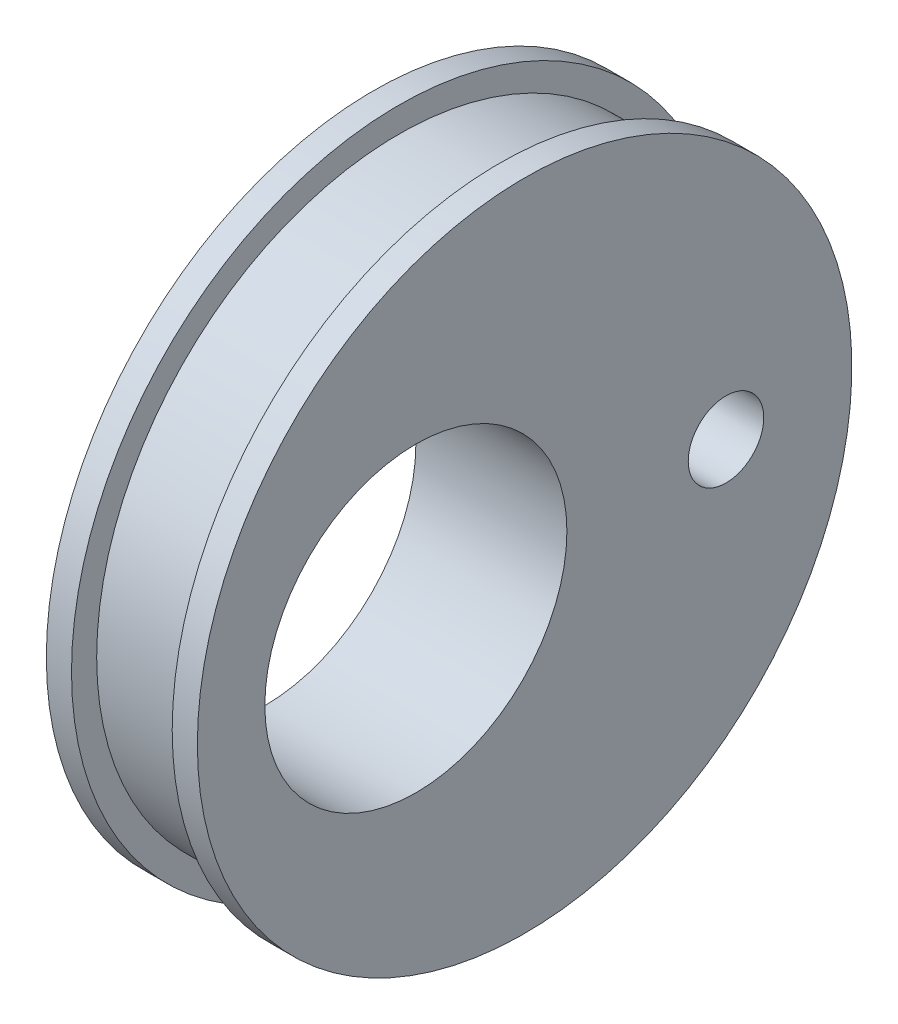
ISO-10303-21;
HEADER;
FILE_DESCRIPTION(('STEP AP214'),'2;1');
FILE_NAME('part.step','',(''),(''),'','','');
FILE_SCHEMA(('AUTOMOTIVE_DESIGN { 1 0 10303 214 1 1 1 1 }'));
ENDSEC;
DATA;
#1=APPLICATION_CONTEXT('core data for automotive mechanical design processes');
#2=APPLICATION_PROTOCOL_DEFINITION('international standard','automotive_design',2000,#1);
#3=PRODUCT_CONTEXT('',#1,'mechanical');
#4=PRODUCT('Part','Part','',(#3));
#5=PRODUCT_RELATED_PRODUCT_CATEGORY('part','',(#4));
#6=PRODUCT_DEFINITION_FORMATION('','',#4);
#7=PRODUCT_DEFINITION_CONTEXT('part definition',#1,'design');
#8=PRODUCT_DEFINITION('design','',#6,#7);
#9=PRODUCT_DEFINITION_SHAPE('','',#8);
#10=(LENGTH_UNIT() NAMED_UNIT(*) SI_UNIT(.MILLI.,.METRE.));
#11=(NAMED_UNIT(*) PLANE_ANGLE_UNIT() SI_UNIT($,.RADIAN.));
#12=(NAMED_UNIT(*) SI_UNIT($,.STERADIAN.) SOLID_ANGLE_UNIT());
#13=UNCERTAINTY_MEASURE_WITH_UNIT(LENGTH_MEASURE(1.E-05),#10,'distance_accuracy_value','');
#14=(GEOMETRIC_REPRESENTATION_CONTEXT(3) GLOBAL_UNCERTAINTY_ASSIGNED_CONTEXT((#13)) GLOBAL_UNIT_ASSIGNED_CONTEXT((#10,
#11,#12)) REPRESENTATION_CONTEXT('',''));
#15=CARTESIAN_POINT('',(0.,0.,0.));
#16=DIRECTION('',(0.,0.,1.));
#17=DIRECTION('',(1.,0.,0.));
#18=AXIS2_PLACEMENT_3D('',#15,#16,#17);
#19=CARTESIAN_POINT('',(9.525,19.05,0.));
#20=DIRECTION('',(-1.,0.,0.));
#21=DIRECTION('',(0.,0.,1.));
#22=AXIS2_PLACEMENT_3D('',#19,#20,#21);
#23=PLANE('',#22);
#24=CARTESIAN_POINT('',(9.525,0.,-12.7));
#25=DIRECTION('',(-1.,0.,0.));
#26=DIRECTION('',(0.,0.,1.));
#27=AXIS2_PLACEMENT_3D('',#24,#25,#26);
#28=CIRCLE('',#27,2.38125);
#29=CARTESIAN_POINT('',(9.525,0.,-10.31875));
#30=VERTEX_POINT('',#29);
#31=EDGE_CURVE('E68',#30,#30,#28,.T.);
#32=ORIENTED_EDGE('',*,*,#31,.T.);
#33=EDGE_LOOP('',(#32));
#34=FACE_BOUND('',#33,.T.);
#35=CARTESIAN_POINT('',(9.525,0.,6.858));
#36=DIRECTION('',(-1.,0.,0.));
#37=DIRECTION('',(0.,0.,1.));
#38=AXIS2_PLACEMENT_3D('',#35,#36,#37);
#39=CIRCLE('',#38,9.525);
#40=CARTESIAN_POINT('',(9.525,0.,16.383));
#41=VERTEX_POINT('',#40);
#42=EDGE_CURVE('E73',#41,#41,#39,.T.);
#43=ORIENTED_EDGE('',*,*,#42,.T.);
#44=EDGE_LOOP('',(#43));
#45=FACE_BOUND('',#44,.T.);
#46=CARTESIAN_POINT('',(9.525,0.,0.));
#47=DIRECTION('',(-1.,0.,0.));
#48=DIRECTION('',(0.,0.,1.));
#49=AXIS2_PLACEMENT_3D('',#46,#47,#48);
#50=CIRCLE('',#49,20.6375);
#51=CARTESIAN_POINT('',(9.525,0.,20.6375));
#52=VERTEX_POINT('',#51);
#53=EDGE_CURVE('E10',#52,#52,#50,.T.);
#54=ORIENTED_EDGE('',*,*,#53,.F.);
#55=EDGE_LOOP('',(#54));
#56=FACE_BOUND('',#55,.T.);
#57=ADVANCED_FACE('F37',(#34,#45,#56),#23,.F.);
#58=CARTESIAN_POINT('',(0.,0.,0.));
#59=DIRECTION('',(-1.,0.,0.));
#60=DIRECTION('',(0.,0.,1.));
#61=AXIS2_PLACEMENT_3D('',#58,#59,#60);
#62=CYLINDRICAL_SURFACE('',#61,20.6375);
#63=CARTESIAN_POINT('',(7.9375,0.,0.));
#64=DIRECTION('',(-1.,0.,0.));
#65=DIRECTION('',(0.,0.,1.));
#66=AXIS2_PLACEMENT_3D('',#63,#64,#65);
#67=CIRCLE('',#66,20.6375);
#68=CARTESIAN_POINT('',(7.9375,0.,20.6375));
#69=VERTEX_POINT('',#68);
#70=EDGE_CURVE('E44',#69,#69,#67,.T.);
#71=ORIENTED_EDGE('',*,*,#70,.F.);
#72=EDGE_LOOP('',(#71));
#73=FACE_BOUND('',#72,.T.);
#74=ORIENTED_EDGE('',*,*,#53,.T.);
#75=EDGE_LOOP('',(#74));
#76=FACE_BOUND('',#75,.T.);
#77=ADVANCED_FACE('F122',(#73,#76),#62,.T.);
#78=CARTESIAN_POINT('',(7.9375,20.6375,0.));
#79=DIRECTION('',(1.,0.,0.));
#80=DIRECTION('',(0.,0.,-1.));
#81=AXIS2_PLACEMENT_3D('',#78,#79,#80);
#82=PLANE('',#81);
#83=CARTESIAN_POINT('',(7.9375,0.,0.));
#84=DIRECTION('',(-1.,0.,0.));
#85=DIRECTION('',(0.,0.,1.));
#86=AXIS2_PLACEMENT_3D('',#83,#84,#85);
#87=CIRCLE('',#86,19.05);
#88=CARTESIAN_POINT('',(7.9375,0.,19.05));
#89=VERTEX_POINT('',#88);
#90=EDGE_CURVE('E49',#89,#89,#87,.T.);
#91=ORIENTED_EDGE('',*,*,#90,.F.);
#92=EDGE_LOOP('',(#91));
#93=FACE_BOUND('',#92,.T.);
#94=ORIENTED_EDGE('',*,*,#70,.T.);
#95=EDGE_LOOP('',(#94));
#96=FACE_BOUND('',#95,.T.);
#97=ADVANCED_FACE('F117',(#93,#96),#82,.F.);
#98=CARTESIAN_POINT('',(0.,0.,0.));
#99=DIRECTION('',(-1.,0.,0.));
#100=DIRECTION('',(0.,0.,1.));
#101=AXIS2_PLACEMENT_3D('',#98,#99,#100);
#102=CYLINDRICAL_SURFACE('',#101,19.05);
#103=CARTESIAN_POINT('',(1.5875,0.,0.));
#104=DIRECTION('',(-1.,0.,0.));
#105=DIRECTION('',(0.,0.,1.));
#106=AXIS2_PLACEMENT_3D('',#103,#104,#105);
#107=CIRCLE('',#106,19.05);
#108=CARTESIAN_POINT('',(1.5875,0.,19.05));
#109=VERTEX_POINT('',#108);
#110=EDGE_CURVE('E54',#109,#109,#107,.T.);
#111=ORIENTED_EDGE('',*,*,#110,.F.);
#112=EDGE_LOOP('',(#111));
#113=FACE_BOUND('',#112,.T.);
#114=ORIENTED_EDGE('',*,*,#90,.T.);
#115=EDGE_LOOP('',(#114));
#116=FACE_BOUND('',#115,.T.);
#117=ADVANCED_FACE('F111',(#113,#116),#102,.T.);
#118=CARTESIAN_POINT('',(1.5875,20.6375,0.));
#119=DIRECTION('',(-1.,0.,0.));
#120=DIRECTION('',(0.,0.,1.));
#121=AXIS2_PLACEMENT_3D('',#118,#119,#120);
#122=PLANE('',#121);
#123=CARTESIAN_POINT('',(1.5875,0.,0.));
#124=DIRECTION('',(-1.,0.,0.));
#125=DIRECTION('',(0.,0.,1.));
#126=AXIS2_PLACEMENT_3D('',#123,#124,#125);
#127=CIRCLE('',#126,20.6375);
#128=CARTESIAN_POINT('',(1.5875,0.,20.6375));
#129=VERTEX_POINT('',#128);
#130=EDGE_CURVE('E60',#129,#129,#127,.T.);
#131=ORIENTED_EDGE('',*,*,#130,.F.);
#132=EDGE_LOOP('',(#131));
#133=FACE_BOUND('',#132,.T.);
#134=ORIENTED_EDGE('',*,*,#110,.T.);
#135=EDGE_LOOP('',(#134));
#136=FACE_BOUND('',#135,.T.);
#137=ADVANCED_FACE('F105',(#133,#136),#122,.F.);
#138=CARTESIAN_POINT('',(0.,0.,0.));
#139=DIRECTION('',(-1.,0.,0.));
#140=DIRECTION('',(0.,0.,1.));
#141=AXIS2_PLACEMENT_3D('',#138,#139,#140);
#142=CYLINDRICAL_SURFACE('',#141,20.6375);
#143=CARTESIAN_POINT('',(0.,0.,0.));
#144=DIRECTION('',(-1.,0.,0.));
#145=DIRECTION('',(0.,0.,1.));
#146=AXIS2_PLACEMENT_3D('',#143,#144,#145);
#147=CIRCLE('',#146,20.6375);
#148=CARTESIAN_POINT('',(0.,0.,20.6375));
#149=VERTEX_POINT('',#148);
#150=EDGE_CURVE('E64',#149,#149,#147,.T.);
#151=ORIENTED_EDGE('',*,*,#150,.F.);
#152=EDGE_LOOP('',(#151));
#153=FACE_BOUND('',#152,.T.);
#154=ORIENTED_EDGE('',*,*,#130,.T.);
#155=EDGE_LOOP('',(#154));
#156=FACE_BOUND('',#155,.T.);
#157=ADVANCED_FACE('F97',(#153,#156),#142,.T.);
#158=CARTESIAN_POINT('',(0.,0.,0.));
#159=DIRECTION('',(1.,0.,0.));
#160=DIRECTION('',(0.,0.,-1.));
#161=AXIS2_PLACEMENT_3D('',#158,#159,#160);
#162=PLANE('',#161);
#163=CARTESIAN_POINT('',(0.,0.,-12.7));
#164=DIRECTION('',(-1.,0.,0.));
#165=DIRECTION('',(0.,0.,1.));
#166=AXIS2_PLACEMENT_3D('',#163,#164,#165);
#167=CIRCLE('',#166,2.38125);
#168=CARTESIAN_POINT('',(0.,0.,-10.31875));
#169=VERTEX_POINT('',#168);
#170=EDGE_CURVE('E77',#169,#169,#167,.T.);
#171=ORIENTED_EDGE('',*,*,#170,.F.);
#172=EDGE_LOOP('',(#171));
#173=FACE_BOUND('',#172,.T.);
#174=CARTESIAN_POINT('',(0.,0.,6.858));
#175=DIRECTION('',(-1.,0.,0.));
#176=DIRECTION('',(0.,0.,1.));
#177=AXIS2_PLACEMENT_3D('',#174,#175,#176);
#178=CIRCLE('',#177,9.525);
#179=CARTESIAN_POINT('',(0.,0.,16.383));
#180=VERTEX_POINT('',#179);
#181=EDGE_CURVE('E69',#180,#180,#178,.T.);
#182=ORIENTED_EDGE('',*,*,#181,.F.);
#183=EDGE_LOOP('',(#182));
#184=FACE_BOUND('',#183,.T.);
#185=ORIENTED_EDGE('',*,*,#150,.T.);
#186=EDGE_LOOP('',(#185));
#187=FACE_BOUND('',#186,.T.);
#188=ADVANCED_FACE('F94',(#173,#184,#187),#162,.F.);
#189=CARTESIAN_POINT('',(9.525,0.,6.858));
#190=DIRECTION('',(-1.,0.,0.));
#191=DIRECTION('',(0.,0.,1.));
#192=AXIS2_PLACEMENT_3D('',#189,#190,#191);
#193=CYLINDRICAL_SURFACE('',#192,9.525);
#194=ORIENTED_EDGE('',*,*,#42,.F.);
#195=EDGE_LOOP('',(#194));
#196=FACE_BOUND('',#195,.T.);
#197=ORIENTED_EDGE('',*,*,#181,.T.);
#198=EDGE_LOOP('',(#197));
#199=FACE_BOUND('',#198,.T.);
#200=ADVANCED_FACE('F90',(#196,#199),#193,.F.);
#201=CARTESIAN_POINT('',(9.525,0.,-12.7));
#202=DIRECTION('',(-1.,0.,0.));
#203=DIRECTION('',(0.,0.,1.));
#204=AXIS2_PLACEMENT_3D('',#201,#202,#203);
#205=CYLINDRICAL_SURFACE('',#204,2.38125);
#206=ORIENTED_EDGE('',*,*,#31,.F.);
#207=EDGE_LOOP('',(#206));
#208=FACE_BOUND('',#207,.T.);
#209=ORIENTED_EDGE('',*,*,#170,.T.);
#210=EDGE_LOOP('',(#209));
#211=FACE_BOUND('',#210,.T.);
#212=ADVANCED_FACE('F87',(#208,#211),#205,.F.);
#213=CLOSED_SHELL('',(#57,#77,#97,#117,#137,#157,#188,#200,#212));
#214=MANIFOLD_SOLID_BREP('B2',#213);
#215=ADVANCED_BREP_SHAPE_REPRESENTATION('',(#18,#214),#14);
#216=SHAPE_DEFINITION_REPRESENTATION(#9,#215);
ENDSEC;
END-ISO-10303-21;
